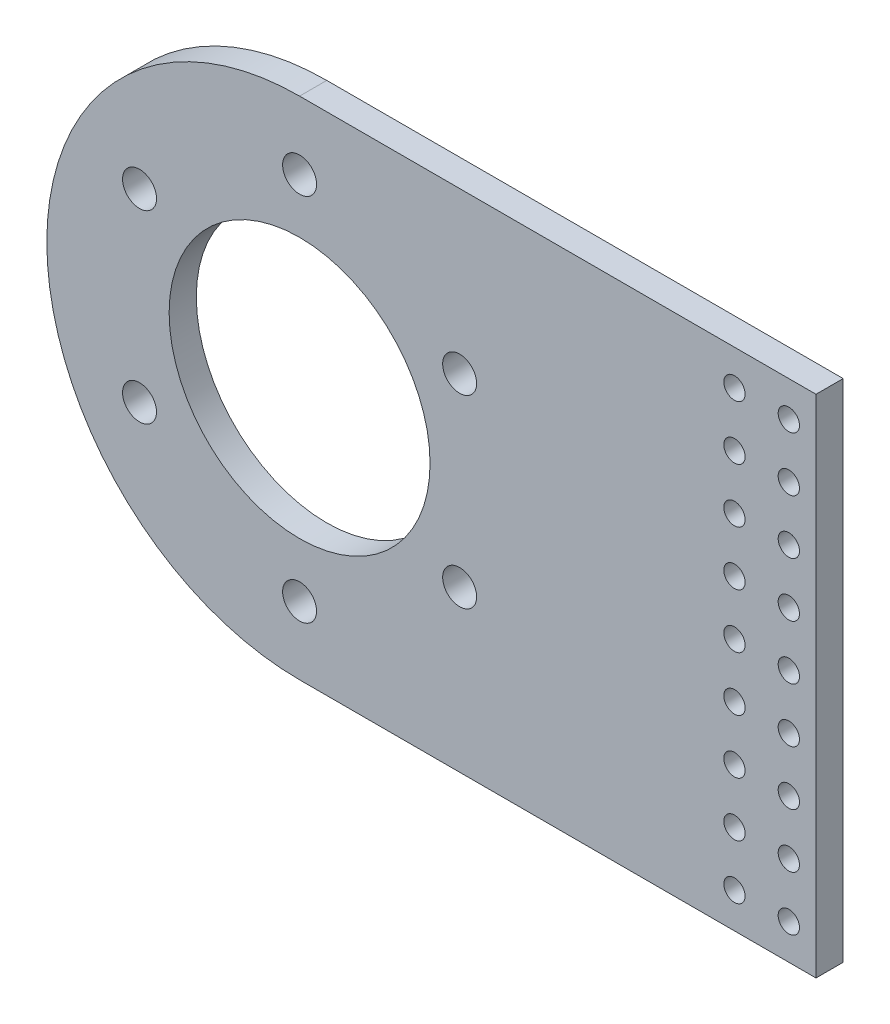
ISO-10303-21;
HEADER;
FILE_DESCRIPTION(('STEP AP214'),'2;1');
FILE_NAME('part.step','',(''),(''),'','','');
FILE_SCHEMA(('AUTOMOTIVE_DESIGN { 1 0 10303 214 1 1 1 1 }'));
ENDSEC;
DATA;
#1=APPLICATION_CONTEXT('core data for automotive mechanical design processes');
#2=APPLICATION_PROTOCOL_DEFINITION('international standard','automotive_design',2000,#1);
#3=PRODUCT_CONTEXT('',#1,'mechanical');
#4=PRODUCT('Part','Part','',(#3));
#5=PRODUCT_RELATED_PRODUCT_CATEGORY('part','',(#4));
#6=PRODUCT_DEFINITION_FORMATION('','',#4);
#7=PRODUCT_DEFINITION_CONTEXT('part definition',#1,'design');
#8=PRODUCT_DEFINITION('design','',#6,#7);
#9=PRODUCT_DEFINITION_SHAPE('','',#8);
#10=(LENGTH_UNIT() NAMED_UNIT(*) SI_UNIT(.MILLI.,.METRE.));
#11=(NAMED_UNIT(*) PLANE_ANGLE_UNIT() SI_UNIT($,.RADIAN.));
#12=(NAMED_UNIT(*) SI_UNIT($,.STERADIAN.) SOLID_ANGLE_UNIT());
#13=UNCERTAINTY_MEASURE_WITH_UNIT(LENGTH_MEASURE(1.E-05),#10,'distance_accuracy_value','');
#14=(GEOMETRIC_REPRESENTATION_CONTEXT(3) GLOBAL_UNCERTAINTY_ASSIGNED_CONTEXT((#13)) GLOBAL_UNIT_ASSIGNED_CONTEXT((#10,
#11,#12)) REPRESENTATION_CONTEXT('',''));
#15=CARTESIAN_POINT('',(0.,0.,0.));
#16=DIRECTION('',(0.,0.,1.));
#17=DIRECTION('',(1.,0.,0.));
#18=AXIS2_PLACEMENT_3D('',#15,#16,#17);
#19=CARTESIAN_POINT('',(0.,0.,6.35));
#20=DIRECTION('',(0.,0.,1.));
#21=DIRECTION('',(1.,0.,0.));
#22=AXIS2_PLACEMENT_3D('',#19,#20,#21);
#23=PLANE('',#22);
#24=CARTESIAN_POINT('',(37.394976935412,21.59,6.35));
#25=DIRECTION('',(0.,0.,1.));
#26=DIRECTION('',(1.,0.,0.));
#27=AXIS2_PLACEMENT_3D('',#24,#25,#26);
#28=CIRCLE('',#27,3.96875);
#29=CARTESIAN_POINT('',(41.3637269354121,21.59,6.35));
#30=VERTEX_POINT('',#29);
#31=EDGE_CURVE('E330',#30,#30,#28,.T.);
#32=ORIENTED_EDGE('',*,*,#31,.F.);
#33=EDGE_LOOP('',(#32));
#34=FACE_BOUND('',#33,.T.);
#35=CARTESIAN_POINT('',(37.3949769354121,-21.59,6.35));
#36=DIRECTION('',(0.,0.,1.));
#37=DIRECTION('',(1.,0.,0.));
#38=AXIS2_PLACEMENT_3D('',#35,#36,#37);
#39=CIRCLE('',#38,3.96875);
#40=CARTESIAN_POINT('',(41.3637269354121,-21.59,6.35));
#41=VERTEX_POINT('',#40);
#42=EDGE_CURVE('E322',#41,#41,#39,.T.);
#43=ORIENTED_EDGE('',*,*,#42,.F.);
#44=EDGE_LOOP('',(#43));
#45=FACE_BOUND('',#44,.T.);
#46=CARTESIAN_POINT('',(0.,-43.18,6.35));
#47=DIRECTION('',(0.,0.,1.));
#48=DIRECTION('',(1.,0.,0.));
#49=AXIS2_PLACEMENT_3D('',#46,#47,#48);
#50=CIRCLE('',#49,3.96875);
#51=CARTESIAN_POINT('',(3.96875,-43.18,6.35));
#52=VERTEX_POINT('',#51);
#53=EDGE_CURVE('E314',#52,#52,#50,.T.);
#54=ORIENTED_EDGE('',*,*,#53,.F.);
#55=EDGE_LOOP('',(#54));
#56=FACE_BOUND('',#55,.T.);
#57=CARTESIAN_POINT('',(-37.3949769354121,-21.59,6.35));
#58=DIRECTION('',(0.,0.,1.));
#59=DIRECTION('',(1.,0.,0.));
#60=AXIS2_PLACEMENT_3D('',#57,#58,#59);
#61=CIRCLE('',#60,3.96875);
#62=CARTESIAN_POINT('',(-33.4262269354121,-21.59,6.35));
#63=VERTEX_POINT('',#62);
#64=EDGE_CURVE('E306',#63,#63,#61,.T.);
#65=ORIENTED_EDGE('',*,*,#64,.F.);
#66=EDGE_LOOP('',(#65));
#67=FACE_BOUND('',#66,.T.);
#68=CARTESIAN_POINT('',(-37.3949769354121,21.59,6.35));
#69=DIRECTION('',(0.,0.,1.));
#70=DIRECTION('',(1.,0.,0.));
#71=AXIS2_PLACEMENT_3D('',#68,#69,#70);
#72=CIRCLE('',#71,3.96875);
#73=CARTESIAN_POINT('',(-33.4262269354121,21.59,6.35));
#74=VERTEX_POINT('',#73);
#75=EDGE_CURVE('E298',#74,#74,#72,.T.);
#76=ORIENTED_EDGE('',*,*,#75,.F.);
#77=EDGE_LOOP('',(#76));
#78=FACE_BOUND('',#77,.T.);
#79=CARTESIAN_POINT('',(0.,43.18,6.35));
#80=DIRECTION('',(0.,0.,1.));
#81=DIRECTION('',(1.,0.,0.));
#82=AXIS2_PLACEMENT_3D('',#79,#80,#81);
#83=CIRCLE('',#82,3.96875);
#84=CARTESIAN_POINT('',(3.96874999999999,43.18,6.35));
#85=VERTEX_POINT('',#84);
#86=EDGE_CURVE('E290',#85,#85,#83,.T.);
#87=ORIENTED_EDGE('',*,*,#86,.F.);
#88=EDGE_LOOP('',(#87));
#89=FACE_BOUND('',#88,.T.);
#90=CARTESIAN_POINT('',(114.3,-50.8,6.35));
#91=DIRECTION('',(0.,0.,1.));
#92=DIRECTION('',(1.,0.,0.));
#93=AXIS2_PLACEMENT_3D('',#90,#91,#92);
#94=CIRCLE('',#93,2.4892);
#95=CARTESIAN_POINT('',(116.7892,-50.8,6.35));
#96=VERTEX_POINT('',#95);
#97=EDGE_CURVE('E282',#96,#96,#94,.T.);
#98=ORIENTED_EDGE('',*,*,#97,.F.);
#99=EDGE_LOOP('',(#98));
#100=FACE_BOUND('',#99,.T.);
#101=CARTESIAN_POINT('',(101.6,-50.8000000000001,6.35));
#102=DIRECTION('',(0.,0.,1.));
#103=DIRECTION('',(1.,0.,0.));
#104=AXIS2_PLACEMENT_3D('',#101,#102,#103);
#105=CIRCLE('',#104,2.4892);
#106=CARTESIAN_POINT('',(104.0892,-50.8000000000001,6.35));
#107=VERTEX_POINT('',#106);
#108=EDGE_CURVE('E274',#107,#107,#105,.T.);
#109=ORIENTED_EDGE('',*,*,#108,.F.);
#110=EDGE_LOOP('',(#109));
#111=FACE_BOUND('',#110,.T.);
#112=CARTESIAN_POINT('',(101.6,-38.1000000000001,6.35));
#113=DIRECTION('',(0.,0.,1.));
#114=DIRECTION('',(1.,0.,0.));
#115=AXIS2_PLACEMENT_3D('',#112,#113,#114);
#116=CIRCLE('',#115,2.4892);
#117=CARTESIAN_POINT('',(104.0892,-38.1000000000001,6.35));
#118=VERTEX_POINT('',#117);
#119=EDGE_CURVE('E266',#118,#118,#116,.T.);
#120=ORIENTED_EDGE('',*,*,#119,.F.);
#121=EDGE_LOOP('',(#120));
#122=FACE_BOUND('',#121,.T.);
#123=CARTESIAN_POINT('',(101.6,-25.4000000000001,6.35));
#124=DIRECTION('',(0.,0.,1.));
#125=DIRECTION('',(1.,0.,0.));
#126=AXIS2_PLACEMENT_3D('',#123,#124,#125);
#127=CIRCLE('',#126,2.4892);
#128=CARTESIAN_POINT('',(104.0892,-25.4000000000001,6.35));
#129=VERTEX_POINT('',#128);
#130=EDGE_CURVE('E258',#129,#129,#127,.T.);
#131=ORIENTED_EDGE('',*,*,#130,.F.);
#132=EDGE_LOOP('',(#131));
#133=FACE_BOUND('',#132,.T.);
#134=CARTESIAN_POINT('',(101.6,-12.7000000000001,6.35));
#135=DIRECTION('',(0.,0.,1.));
#136=DIRECTION('',(1.,0.,0.));
#137=AXIS2_PLACEMENT_3D('',#134,#135,#136);
#138=CIRCLE('',#137,2.4892);
#139=CARTESIAN_POINT('',(104.0892,-12.7000000000001,6.35));
#140=VERTEX_POINT('',#139);
#141=EDGE_CURVE('E250',#140,#140,#138,.T.);
#142=ORIENTED_EDGE('',*,*,#141,.F.);
#143=EDGE_LOOP('',(#142));
#144=FACE_BOUND('',#143,.T.);
#145=CARTESIAN_POINT('',(101.6,0.,6.35));
#146=DIRECTION('',(0.,0.,1.));
#147=DIRECTION('',(1.,0.,0.));
#148=AXIS2_PLACEMENT_3D('',#145,#146,#147);
#149=CIRCLE('',#148,2.4892);
#150=CARTESIAN_POINT('',(104.0892,0.,6.35));
#151=VERTEX_POINT('',#150);
#152=EDGE_CURVE('E242',#151,#151,#149,.T.);
#153=ORIENTED_EDGE('',*,*,#152,.F.);
#154=EDGE_LOOP('',(#153));
#155=FACE_BOUND('',#154,.T.);
#156=CARTESIAN_POINT('',(101.6,12.6999999999999,6.35));
#157=DIRECTION('',(0.,0.,1.));
#158=DIRECTION('',(1.,0.,0.));
#159=AXIS2_PLACEMENT_3D('',#156,#157,#158);
#160=CIRCLE('',#159,2.4892);
#161=CARTESIAN_POINT('',(104.0892,12.6999999999999,6.35));
#162=VERTEX_POINT('',#161);
#163=EDGE_CURVE('E234',#162,#162,#160,.T.);
#164=ORIENTED_EDGE('',*,*,#163,.F.);
#165=EDGE_LOOP('',(#164));
#166=FACE_BOUND('',#165,.T.);
#167=CARTESIAN_POINT('',(101.6,25.3999999999999,6.35));
#168=DIRECTION('',(0.,0.,1.));
#169=DIRECTION('',(1.,0.,0.));
#170=AXIS2_PLACEMENT_3D('',#167,#168,#169);
#171=CIRCLE('',#170,2.4892);
#172=CARTESIAN_POINT('',(104.0892,25.3999999999999,6.35));
#173=VERTEX_POINT('',#172);
#174=EDGE_CURVE('E226',#173,#173,#171,.T.);
#175=ORIENTED_EDGE('',*,*,#174,.F.);
#176=EDGE_LOOP('',(#175));
#177=FACE_BOUND('',#176,.T.);
#178=CARTESIAN_POINT('',(101.6,38.0999999999999,6.35));
#179=DIRECTION('',(0.,0.,1.));
#180=DIRECTION('',(1.,0.,0.));
#181=AXIS2_PLACEMENT_3D('',#178,#179,#180);
#182=CIRCLE('',#181,2.4892);
#183=CARTESIAN_POINT('',(104.0892,38.0999999999999,6.35));
#184=VERTEX_POINT('',#183);
#185=EDGE_CURVE('E218',#184,#184,#182,.T.);
#186=ORIENTED_EDGE('',*,*,#185,.F.);
#187=EDGE_LOOP('',(#186));
#188=FACE_BOUND('',#187,.T.);
#189=CARTESIAN_POINT('',(101.6,50.7999999999999,6.35));
#190=DIRECTION('',(0.,0.,1.));
#191=DIRECTION('',(1.,0.,0.));
#192=AXIS2_PLACEMENT_3D('',#189,#190,#191);
#193=CIRCLE('',#192,2.4892);
#194=CARTESIAN_POINT('',(104.0892,50.7999999999999,6.35));
#195=VERTEX_POINT('',#194);
#196=EDGE_CURVE('E210',#195,#195,#193,.T.);
#197=ORIENTED_EDGE('',*,*,#196,.F.);
#198=EDGE_LOOP('',(#197));
#199=FACE_BOUND('',#198,.T.);
#200=CARTESIAN_POINT('',(114.3,-38.1,6.35));
#201=DIRECTION('',(0.,0.,1.));
#202=DIRECTION('',(1.,0.,0.));
#203=AXIS2_PLACEMENT_3D('',#200,#201,#202);
#204=CIRCLE('',#203,2.4892);
#205=CARTESIAN_POINT('',(116.7892,-38.1,6.35));
#206=VERTEX_POINT('',#205);
#207=EDGE_CURVE('E202',#206,#206,#204,.T.);
#208=ORIENTED_EDGE('',*,*,#207,.F.);
#209=EDGE_LOOP('',(#208));
#210=FACE_BOUND('',#209,.T.);
#211=CARTESIAN_POINT('',(114.3,-25.4,6.35));
#212=DIRECTION('',(0.,0.,1.));
#213=DIRECTION('',(1.,0.,0.));
#214=AXIS2_PLACEMENT_3D('',#211,#212,#213);
#215=CIRCLE('',#214,2.4892);
#216=CARTESIAN_POINT('',(116.7892,-25.4,6.35));
#217=VERTEX_POINT('',#216);
#218=EDGE_CURVE('E194',#217,#217,#215,.T.);
#219=ORIENTED_EDGE('',*,*,#218,.F.);
#220=EDGE_LOOP('',(#219));
#221=FACE_BOUND('',#220,.T.);
#222=CARTESIAN_POINT('',(114.3,-12.7,6.35));
#223=DIRECTION('',(0.,0.,1.));
#224=DIRECTION('',(1.,0.,0.));
#225=AXIS2_PLACEMENT_3D('',#222,#223,#224);
#226=CIRCLE('',#225,2.4892);
#227=CARTESIAN_POINT('',(116.7892,-12.7,6.35));
#228=VERTEX_POINT('',#227);
#229=EDGE_CURVE('E186',#228,#228,#226,.T.);
#230=ORIENTED_EDGE('',*,*,#229,.F.);
#231=EDGE_LOOP('',(#230));
#232=FACE_BOUND('',#231,.T.);
#233=CARTESIAN_POINT('',(114.3,0.,6.35));
#234=DIRECTION('',(0.,0.,1.));
#235=DIRECTION('',(1.,0.,0.));
#236=AXIS2_PLACEMENT_3D('',#233,#234,#235);
#237=CIRCLE('',#236,2.4892);
#238=CARTESIAN_POINT('',(116.7892,0.,6.35));
#239=VERTEX_POINT('',#238);
#240=EDGE_CURVE('E178',#239,#239,#237,.T.);
#241=ORIENTED_EDGE('',*,*,#240,.F.);
#242=EDGE_LOOP('',(#241));
#243=FACE_BOUND('',#242,.T.);
#244=CARTESIAN_POINT('',(114.3,12.7,6.35));
#245=DIRECTION('',(0.,0.,1.));
#246=DIRECTION('',(1.,0.,0.));
#247=AXIS2_PLACEMENT_3D('',#244,#245,#246);
#248=CIRCLE('',#247,2.4892);
#249=CARTESIAN_POINT('',(116.7892,12.7,6.35));
#250=VERTEX_POINT('',#249);
#251=EDGE_CURVE('E170',#250,#250,#248,.T.);
#252=ORIENTED_EDGE('',*,*,#251,.F.);
#253=EDGE_LOOP('',(#252));
#254=FACE_BOUND('',#253,.T.);
#255=CARTESIAN_POINT('',(114.3,25.4,6.35));
#256=DIRECTION('',(0.,0.,1.));
#257=DIRECTION('',(1.,0.,0.));
#258=AXIS2_PLACEMENT_3D('',#255,#256,#257);
#259=CIRCLE('',#258,2.4892);
#260=CARTESIAN_POINT('',(116.7892,25.4,6.35));
#261=VERTEX_POINT('',#260);
#262=EDGE_CURVE('E162',#261,#261,#259,.T.);
#263=ORIENTED_EDGE('',*,*,#262,.F.);
#264=EDGE_LOOP('',(#263));
#265=FACE_BOUND('',#264,.T.);
#266=CARTESIAN_POINT('',(114.3,38.1,6.35));
#267=DIRECTION('',(0.,0.,1.));
#268=DIRECTION('',(1.,0.,0.));
#269=AXIS2_PLACEMENT_3D('',#266,#267,#268);
#270=CIRCLE('',#269,2.4892);
#271=CARTESIAN_POINT('',(116.7892,38.1,6.35));
#272=VERTEX_POINT('',#271);
#273=EDGE_CURVE('E154',#272,#272,#270,.T.);
#274=ORIENTED_EDGE('',*,*,#273,.F.);
#275=EDGE_LOOP('',(#274));
#276=FACE_BOUND('',#275,.T.);
#277=CARTESIAN_POINT('',(114.3,50.8,6.35));
#278=DIRECTION('',(0.,0.,1.));
#279=DIRECTION('',(1.,0.,0.));
#280=AXIS2_PLACEMENT_3D('',#277,#278,#279);
#281=CIRCLE('',#280,2.4892);
#282=CARTESIAN_POINT('',(116.7892,50.8,6.35));
#283=VERTEX_POINT('',#282);
#284=EDGE_CURVE('E146',#283,#283,#281,.T.);
#285=ORIENTED_EDGE('',*,*,#284,.F.);
#286=EDGE_LOOP('',(#285));
#287=FACE_BOUND('',#286,.T.);
#288=CARTESIAN_POINT('',(0.,0.,6.35));
#289=DIRECTION('',(0.,0.,1.));
#290=DIRECTION('',(1.,0.,0.));
#291=AXIS2_PLACEMENT_3D('',#288,#289,#290);
#292=CIRCLE('',#291,59.055);
#293=CARTESIAN_POINT('',(0.,59.055,6.35));
#294=VERTEX_POINT('',#293);
#295=CARTESIAN_POINT('',(0.,-59.055,6.35));
#296=VERTEX_POINT('',#295);
#297=EDGE_CURVE('E97',#294,#296,#292,.T.);
#298=ORIENTED_EDGE('',*,*,#297,.T.);
#299=DIRECTION('',(1.,0.,0.));
#300=VECTOR('',#299,1.);
#301=CARTESIAN_POINT('',(0.,-59.055,6.35));
#302=LINE('',#301,#300);
#303=CARTESIAN_POINT('',(120.65,-59.055,6.35));
#304=VERTEX_POINT('',#303);
#305=EDGE_CURVE('E92',#296,#304,#302,.T.);
#306=ORIENTED_EDGE('',*,*,#305,.T.);
#307=DIRECTION('',(0.,1.,0.));
#308=VECTOR('',#307,1.);
#309=CARTESIAN_POINT('',(120.65,-59.055,6.35));
#310=LINE('',#309,#308);
#311=CARTESIAN_POINT('',(120.65,59.055,6.35));
#312=VERTEX_POINT('',#311);
#313=EDGE_CURVE('E95',#304,#312,#310,.T.);
#314=ORIENTED_EDGE('',*,*,#313,.T.);
#315=DIRECTION('',(-1.,0.,0.));
#316=VECTOR('',#315,1.);
#317=CARTESIAN_POINT('',(120.65,59.055,6.35));
#318=LINE('',#317,#316);
#319=EDGE_CURVE('E62',#312,#294,#318,.T.);
#320=ORIENTED_EDGE('',*,*,#319,.T.);
#321=EDGE_LOOP('',(#298,#306,#314,#320));
#322=FACE_BOUND('',#321,.T.);
#323=CARTESIAN_POINT('',(0.,0.,6.35));
#324=DIRECTION('',(0.,0.,1.));
#325=DIRECTION('',(1.,0.,0.));
#326=AXIS2_PLACEMENT_3D('',#323,#324,#325);
#327=CIRCLE('',#326,30.48);
#328=CARTESIAN_POINT('',(30.48,0.,6.35));
#329=VERTEX_POINT('',#328);
#330=EDGE_CURVE('E117',#329,#329,#327,.T.);
#331=ORIENTED_EDGE('',*,*,#330,.F.);
#332=EDGE_LOOP('',(#331));
#333=FACE_BOUND('',#332,.T.);
#334=ADVANCED_FACE('F44',(#34,#45,#56,#67,#78,#89,#100,#111,#122,#133,#144,#155,#166,#177,#188,
#199,#210,#221,#232,#243,#254,#265,#276,#287,#322,#333),#23,.T.);
#335=CARTESIAN_POINT('',(0.,0.,0.));
#336=DIRECTION('',(0.,0.,1.));
#337=DIRECTION('',(1.,0.,0.));
#338=AXIS2_PLACEMENT_3D('',#335,#336,#337);
#339=PLANE('',#338);
#340=CARTESIAN_POINT('',(37.394976935412,21.59,0.));
#341=DIRECTION('',(0.,0.,1.));
#342=DIRECTION('',(1.,0.,0.));
#343=AXIS2_PLACEMENT_3D('',#340,#341,#342);
#344=CIRCLE('',#343,3.96875);
#345=CARTESIAN_POINT('',(41.3637269354121,21.59,0.));
#346=VERTEX_POINT('',#345);
#347=EDGE_CURVE('E326',#346,#346,#344,.T.);
#348=ORIENTED_EDGE('',*,*,#347,.T.);
#349=EDGE_LOOP('',(#348));
#350=FACE_BOUND('',#349,.T.);
#351=CARTESIAN_POINT('',(37.3949769354121,-21.59,0.));
#352=DIRECTION('',(0.,0.,1.));
#353=DIRECTION('',(1.,0.,0.));
#354=AXIS2_PLACEMENT_3D('',#351,#352,#353);
#355=CIRCLE('',#354,3.96875);
#356=CARTESIAN_POINT('',(41.3637269354121,-21.59,0.));
#357=VERTEX_POINT('',#356);
#358=EDGE_CURVE('E318',#357,#357,#355,.T.);
#359=ORIENTED_EDGE('',*,*,#358,.T.);
#360=EDGE_LOOP('',(#359));
#361=FACE_BOUND('',#360,.T.);
#362=CARTESIAN_POINT('',(0.,-43.18,0.));
#363=DIRECTION('',(0.,0.,1.));
#364=DIRECTION('',(1.,0.,0.));
#365=AXIS2_PLACEMENT_3D('',#362,#363,#364);
#366=CIRCLE('',#365,3.96875);
#367=CARTESIAN_POINT('',(3.96875,-43.18,0.));
#368=VERTEX_POINT('',#367);
#369=EDGE_CURVE('E310',#368,#368,#366,.T.);
#370=ORIENTED_EDGE('',*,*,#369,.T.);
#371=EDGE_LOOP('',(#370));
#372=FACE_BOUND('',#371,.T.);
#373=CARTESIAN_POINT('',(-37.3949769354121,-21.59,0.));
#374=DIRECTION('',(0.,0.,1.));
#375=DIRECTION('',(1.,0.,0.));
#376=AXIS2_PLACEMENT_3D('',#373,#374,#375);
#377=CIRCLE('',#376,3.96875);
#378=CARTESIAN_POINT('',(-33.4262269354121,-21.59,0.));
#379=VERTEX_POINT('',#378);
#380=EDGE_CURVE('E302',#379,#379,#377,.T.);
#381=ORIENTED_EDGE('',*,*,#380,.T.);
#382=EDGE_LOOP('',(#381));
#383=FACE_BOUND('',#382,.T.);
#384=CARTESIAN_POINT('',(-37.3949769354121,21.59,0.));
#385=DIRECTION('',(0.,0.,1.));
#386=DIRECTION('',(1.,0.,0.));
#387=AXIS2_PLACEMENT_3D('',#384,#385,#386);
#388=CIRCLE('',#387,3.96875);
#389=CARTESIAN_POINT('',(-33.4262269354121,21.59,0.));
#390=VERTEX_POINT('',#389);
#391=EDGE_CURVE('E294',#390,#390,#388,.T.);
#392=ORIENTED_EDGE('',*,*,#391,.T.);
#393=EDGE_LOOP('',(#392));
#394=FACE_BOUND('',#393,.T.);
#395=CARTESIAN_POINT('',(0.,43.18,0.));
#396=DIRECTION('',(0.,0.,1.));
#397=DIRECTION('',(1.,0.,0.));
#398=AXIS2_PLACEMENT_3D('',#395,#396,#397);
#399=CIRCLE('',#398,3.96875);
#400=CARTESIAN_POINT('',(3.96874999999999,43.18,0.));
#401=VERTEX_POINT('',#400);
#402=EDGE_CURVE('E286',#401,#401,#399,.T.);
#403=ORIENTED_EDGE('',*,*,#402,.T.);
#404=EDGE_LOOP('',(#403));
#405=FACE_BOUND('',#404,.T.);
#406=CARTESIAN_POINT('',(114.3,-50.8,0.));
#407=DIRECTION('',(0.,0.,1.));
#408=DIRECTION('',(1.,0.,0.));
#409=AXIS2_PLACEMENT_3D('',#406,#407,#408);
#410=CIRCLE('',#409,2.4892);
#411=CARTESIAN_POINT('',(116.7892,-50.8,0.));
#412=VERTEX_POINT('',#411);
#413=EDGE_CURVE('E278',#412,#412,#410,.T.);
#414=ORIENTED_EDGE('',*,*,#413,.T.);
#415=EDGE_LOOP('',(#414));
#416=FACE_BOUND('',#415,.T.);
#417=CARTESIAN_POINT('',(101.6,-50.8000000000001,0.));
#418=DIRECTION('',(0.,0.,1.));
#419=DIRECTION('',(1.,0.,0.));
#420=AXIS2_PLACEMENT_3D('',#417,#418,#419);
#421=CIRCLE('',#420,2.4892);
#422=CARTESIAN_POINT('',(104.0892,-50.8000000000001,0.));
#423=VERTEX_POINT('',#422);
#424=EDGE_CURVE('E270',#423,#423,#421,.T.);
#425=ORIENTED_EDGE('',*,*,#424,.T.);
#426=EDGE_LOOP('',(#425));
#427=FACE_BOUND('',#426,.T.);
#428=CARTESIAN_POINT('',(101.6,-38.1000000000001,0.));
#429=DIRECTION('',(0.,0.,1.));
#430=DIRECTION('',(1.,0.,0.));
#431=AXIS2_PLACEMENT_3D('',#428,#429,#430);
#432=CIRCLE('',#431,2.4892);
#433=CARTESIAN_POINT('',(104.0892,-38.1000000000001,0.));
#434=VERTEX_POINT('',#433);
#435=EDGE_CURVE('E262',#434,#434,#432,.T.);
#436=ORIENTED_EDGE('',*,*,#435,.T.);
#437=EDGE_LOOP('',(#436));
#438=FACE_BOUND('',#437,.T.);
#439=CARTESIAN_POINT('',(101.6,-25.4000000000001,0.));
#440=DIRECTION('',(0.,0.,1.));
#441=DIRECTION('',(1.,0.,0.));
#442=AXIS2_PLACEMENT_3D('',#439,#440,#441);
#443=CIRCLE('',#442,2.4892);
#444=CARTESIAN_POINT('',(104.0892,-25.4000000000001,0.));
#445=VERTEX_POINT('',#444);
#446=EDGE_CURVE('E254',#445,#445,#443,.T.);
#447=ORIENTED_EDGE('',*,*,#446,.T.);
#448=EDGE_LOOP('',(#447));
#449=FACE_BOUND('',#448,.T.);
#450=CARTESIAN_POINT('',(101.6,-12.7000000000001,0.));
#451=DIRECTION('',(0.,0.,1.));
#452=DIRECTION('',(1.,0.,0.));
#453=AXIS2_PLACEMENT_3D('',#450,#451,#452);
#454=CIRCLE('',#453,2.4892);
#455=CARTESIAN_POINT('',(104.0892,-12.7000000000001,0.));
#456=VERTEX_POINT('',#455);
#457=EDGE_CURVE('E246',#456,#456,#454,.T.);
#458=ORIENTED_EDGE('',*,*,#457,.T.);
#459=EDGE_LOOP('',(#458));
#460=FACE_BOUND('',#459,.T.);
#461=CARTESIAN_POINT('',(101.6,0.,0.));
#462=DIRECTION('',(0.,0.,1.));
#463=DIRECTION('',(1.,0.,0.));
#464=AXIS2_PLACEMENT_3D('',#461,#462,#463);
#465=CIRCLE('',#464,2.4892);
#466=CARTESIAN_POINT('',(104.0892,0.,0.));
#467=VERTEX_POINT('',#466);
#468=EDGE_CURVE('E238',#467,#467,#465,.T.);
#469=ORIENTED_EDGE('',*,*,#468,.T.);
#470=EDGE_LOOP('',(#469));
#471=FACE_BOUND('',#470,.T.);
#472=CARTESIAN_POINT('',(101.6,12.6999999999999,0.));
#473=DIRECTION('',(0.,0.,1.));
#474=DIRECTION('',(1.,0.,0.));
#475=AXIS2_PLACEMENT_3D('',#472,#473,#474);
#476=CIRCLE('',#475,2.4892);
#477=CARTESIAN_POINT('',(104.0892,12.6999999999999,0.));
#478=VERTEX_POINT('',#477);
#479=EDGE_CURVE('E230',#478,#478,#476,.T.);
#480=ORIENTED_EDGE('',*,*,#479,.T.);
#481=EDGE_LOOP('',(#480));
#482=FACE_BOUND('',#481,.T.);
#483=CARTESIAN_POINT('',(101.6,25.3999999999999,0.));
#484=DIRECTION('',(0.,0.,1.));
#485=DIRECTION('',(1.,0.,0.));
#486=AXIS2_PLACEMENT_3D('',#483,#484,#485);
#487=CIRCLE('',#486,2.4892);
#488=CARTESIAN_POINT('',(104.0892,25.3999999999999,0.));
#489=VERTEX_POINT('',#488);
#490=EDGE_CURVE('E222',#489,#489,#487,.T.);
#491=ORIENTED_EDGE('',*,*,#490,.T.);
#492=EDGE_LOOP('',(#491));
#493=FACE_BOUND('',#492,.T.);
#494=CARTESIAN_POINT('',(101.6,38.0999999999999,0.));
#495=DIRECTION('',(0.,0.,1.));
#496=DIRECTION('',(1.,0.,0.));
#497=AXIS2_PLACEMENT_3D('',#494,#495,#496);
#498=CIRCLE('',#497,2.4892);
#499=CARTESIAN_POINT('',(104.0892,38.0999999999999,0.));
#500=VERTEX_POINT('',#499);
#501=EDGE_CURVE('E214',#500,#500,#498,.T.);
#502=ORIENTED_EDGE('',*,*,#501,.T.);
#503=EDGE_LOOP('',(#502));
#504=FACE_BOUND('',#503,.T.);
#505=CARTESIAN_POINT('',(101.6,50.7999999999999,0.));
#506=DIRECTION('',(0.,0.,1.));
#507=DIRECTION('',(1.,0.,0.));
#508=AXIS2_PLACEMENT_3D('',#505,#506,#507);
#509=CIRCLE('',#508,2.4892);
#510=CARTESIAN_POINT('',(104.0892,50.7999999999999,0.));
#511=VERTEX_POINT('',#510);
#512=EDGE_CURVE('E206',#511,#511,#509,.T.);
#513=ORIENTED_EDGE('',*,*,#512,.T.);
#514=EDGE_LOOP('',(#513));
#515=FACE_BOUND('',#514,.T.);
#516=CARTESIAN_POINT('',(114.3,-38.1,0.));
#517=DIRECTION('',(0.,0.,1.));
#518=DIRECTION('',(1.,0.,0.));
#519=AXIS2_PLACEMENT_3D('',#516,#517,#518);
#520=CIRCLE('',#519,2.4892);
#521=CARTESIAN_POINT('',(116.7892,-38.1,0.));
#522=VERTEX_POINT('',#521);
#523=EDGE_CURVE('E198',#522,#522,#520,.T.);
#524=ORIENTED_EDGE('',*,*,#523,.T.);
#525=EDGE_LOOP('',(#524));
#526=FACE_BOUND('',#525,.T.);
#527=CARTESIAN_POINT('',(114.3,-25.4,0.));
#528=DIRECTION('',(0.,0.,1.));
#529=DIRECTION('',(1.,0.,0.));
#530=AXIS2_PLACEMENT_3D('',#527,#528,#529);
#531=CIRCLE('',#530,2.4892);
#532=CARTESIAN_POINT('',(116.7892,-25.4,0.));
#533=VERTEX_POINT('',#532);
#534=EDGE_CURVE('E190',#533,#533,#531,.T.);
#535=ORIENTED_EDGE('',*,*,#534,.T.);
#536=EDGE_LOOP('',(#535));
#537=FACE_BOUND('',#536,.T.);
#538=CARTESIAN_POINT('',(114.3,-12.7,0.));
#539=DIRECTION('',(0.,0.,1.));
#540=DIRECTION('',(1.,0.,0.));
#541=AXIS2_PLACEMENT_3D('',#538,#539,#540);
#542=CIRCLE('',#541,2.4892);
#543=CARTESIAN_POINT('',(116.7892,-12.7,0.));
#544=VERTEX_POINT('',#543);
#545=EDGE_CURVE('E182',#544,#544,#542,.T.);
#546=ORIENTED_EDGE('',*,*,#545,.T.);
#547=EDGE_LOOP('',(#546));
#548=FACE_BOUND('',#547,.T.);
#549=CARTESIAN_POINT('',(114.3,0.,0.));
#550=DIRECTION('',(0.,0.,1.));
#551=DIRECTION('',(1.,0.,0.));
#552=AXIS2_PLACEMENT_3D('',#549,#550,#551);
#553=CIRCLE('',#552,2.4892);
#554=CARTESIAN_POINT('',(116.7892,0.,0.));
#555=VERTEX_POINT('',#554);
#556=EDGE_CURVE('E174',#555,#555,#553,.T.);
#557=ORIENTED_EDGE('',*,*,#556,.T.);
#558=EDGE_LOOP('',(#557));
#559=FACE_BOUND('',#558,.T.);
#560=CARTESIAN_POINT('',(114.3,12.7,0.));
#561=DIRECTION('',(0.,0.,1.));
#562=DIRECTION('',(1.,0.,0.));
#563=AXIS2_PLACEMENT_3D('',#560,#561,#562);
#564=CIRCLE('',#563,2.4892);
#565=CARTESIAN_POINT('',(116.7892,12.7,0.));
#566=VERTEX_POINT('',#565);
#567=EDGE_CURVE('E166',#566,#566,#564,.T.);
#568=ORIENTED_EDGE('',*,*,#567,.T.);
#569=EDGE_LOOP('',(#568));
#570=FACE_BOUND('',#569,.T.);
#571=CARTESIAN_POINT('',(114.3,25.4,0.));
#572=DIRECTION('',(0.,0.,1.));
#573=DIRECTION('',(1.,0.,0.));
#574=AXIS2_PLACEMENT_3D('',#571,#572,#573);
#575=CIRCLE('',#574,2.4892);
#576=CARTESIAN_POINT('',(116.7892,25.4,0.));
#577=VERTEX_POINT('',#576);
#578=EDGE_CURVE('E158',#577,#577,#575,.T.);
#579=ORIENTED_EDGE('',*,*,#578,.T.);
#580=EDGE_LOOP('',(#579));
#581=FACE_BOUND('',#580,.T.);
#582=CARTESIAN_POINT('',(114.3,38.1,0.));
#583=DIRECTION('',(0.,0.,1.));
#584=DIRECTION('',(1.,0.,0.));
#585=AXIS2_PLACEMENT_3D('',#582,#583,#584);
#586=CIRCLE('',#585,2.4892);
#587=CARTESIAN_POINT('',(116.7892,38.1,0.));
#588=VERTEX_POINT('',#587);
#589=EDGE_CURVE('E150',#588,#588,#586,.T.);
#590=ORIENTED_EDGE('',*,*,#589,.T.);
#591=EDGE_LOOP('',(#590));
#592=FACE_BOUND('',#591,.T.);
#593=CARTESIAN_POINT('',(114.3,50.8,0.));
#594=DIRECTION('',(0.,0.,1.));
#595=DIRECTION('',(1.,0.,0.));
#596=AXIS2_PLACEMENT_3D('',#593,#594,#595);
#597=CIRCLE('',#596,2.4892);
#598=CARTESIAN_POINT('',(116.7892,50.8,0.));
#599=VERTEX_POINT('',#598);
#600=EDGE_CURVE('E139',#599,#599,#597,.T.);
#601=ORIENTED_EDGE('',*,*,#600,.T.);
#602=EDGE_LOOP('',(#601));
#603=FACE_BOUND('',#602,.T.);
#604=CARTESIAN_POINT('',(0.,0.,0.));
#605=DIRECTION('',(0.,0.,1.));
#606=DIRECTION('',(1.,0.,0.));
#607=AXIS2_PLACEMENT_3D('',#604,#605,#606);
#608=CIRCLE('',#607,59.055);
#609=CARTESIAN_POINT('',(0.,59.055,0.));
#610=VERTEX_POINT('',#609);
#611=CARTESIAN_POINT('',(0.,-59.055,0.));
#612=VERTEX_POINT('',#611);
#613=EDGE_CURVE('E113',#610,#612,#608,.T.);
#614=ORIENTED_EDGE('',*,*,#613,.F.);
#615=DIRECTION('',(-1.,0.,0.));
#616=VECTOR('',#615,1.);
#617=CARTESIAN_POINT('',(120.65,59.055,0.));
#618=LINE('',#617,#616);
#619=CARTESIAN_POINT('',(120.65,59.055,0.));
#620=VERTEX_POINT('',#619);
#621=EDGE_CURVE('E85',#620,#610,#618,.T.);
#622=ORIENTED_EDGE('',*,*,#621,.F.);
#623=DIRECTION('',(0.,1.,0.));
#624=VECTOR('',#623,1.);
#625=CARTESIAN_POINT('',(120.65,-59.055,0.));
#626=LINE('',#625,#624);
#627=CARTESIAN_POINT('',(120.65,-59.055,0.));
#628=VERTEX_POINT('',#627);
#629=EDGE_CURVE('E79',#628,#620,#626,.T.);
#630=ORIENTED_EDGE('',*,*,#629,.F.);
#631=DIRECTION('',(1.,0.,0.));
#632=VECTOR('',#631,1.);
#633=CARTESIAN_POINT('',(0.,-59.055,0.));
#634=LINE('',#633,#632);
#635=EDGE_CURVE('E102',#612,#628,#634,.T.);
#636=ORIENTED_EDGE('',*,*,#635,.F.);
#637=EDGE_LOOP('',(#614,#622,#630,#636));
#638=FACE_BOUND('',#637,.T.);
#639=CARTESIAN_POINT('',(0.,0.,0.));
#640=DIRECTION('',(0.,0.,1.));
#641=DIRECTION('',(1.,0.,0.));
#642=AXIS2_PLACEMENT_3D('',#639,#640,#641);
#643=CIRCLE('',#642,30.48);
#644=CARTESIAN_POINT('',(30.48,0.,0.));
#645=VERTEX_POINT('',#644);
#646=EDGE_CURVE('E135',#645,#645,#643,.T.);
#647=ORIENTED_EDGE('',*,*,#646,.T.);
#648=EDGE_LOOP('',(#647));
#649=FACE_BOUND('',#648,.T.);
#650=ADVANCED_FACE('F130',(#350,#361,#372,#383,#394,#405,#416,#427,#438,#449,#460,#471,#482,
#493,#504,#515,#526,#537,#548,#559,#570,#581,#592,#603,#638,#649),#339,.F.);
#651=CARTESIAN_POINT('',(0.,0.,6.35));
#652=DIRECTION('',(0.,0.,-1.));
#653=DIRECTION('',(-1.,0.,0.));
#654=AXIS2_PLACEMENT_3D('',#651,#652,#653);
#655=CYLINDRICAL_SURFACE('',#654,59.055);
#656=ORIENTED_EDGE('',*,*,#613,.T.);
#657=DIRECTION('',(0.,0.,-1.));
#658=VECTOR('',#657,1.);
#659=CARTESIAN_POINT('',(0.,-59.055,6.35));
#660=LINE('',#659,#658);
#661=EDGE_CURVE('E11',#296,#612,#660,.T.);
#662=ORIENTED_EDGE('',*,*,#661,.F.);
#663=ORIENTED_EDGE('',*,*,#297,.F.);
#664=DIRECTION('',(0.,0.,-1.));
#665=VECTOR('',#664,1.);
#666=CARTESIAN_POINT('',(0.,59.055,6.35));
#667=LINE('',#666,#665);
#668=EDGE_CURVE('E109',#294,#610,#667,.T.);
#669=ORIENTED_EDGE('',*,*,#668,.T.);
#670=EDGE_LOOP('',(#656,#662,#663,#669));
#671=FACE_BOUND('',#670,.T.);
#672=ADVANCED_FACE('F46',(#671),#655,.T.);
#673=CARTESIAN_POINT('',(0.,-59.055,6.35));
#674=DIRECTION('',(0.,1.,0.));
#675=DIRECTION('',(-1.,0.,0.));
#676=AXIS2_PLACEMENT_3D('',#673,#674,#675);
#677=PLANE('',#676);
#678=ORIENTED_EDGE('',*,*,#635,.T.);
#679=DIRECTION('',(0.,0.,-1.));
#680=VECTOR('',#679,1.);
#681=CARTESIAN_POINT('',(120.65,-59.055,6.35));
#682=LINE('',#681,#680);
#683=EDGE_CURVE('E54',#304,#628,#682,.T.);
#684=ORIENTED_EDGE('',*,*,#683,.F.);
#685=ORIENTED_EDGE('',*,*,#305,.F.);
#686=ORIENTED_EDGE('',*,*,#661,.T.);
#687=EDGE_LOOP('',(#678,#684,#685,#686));
#688=FACE_BOUND('',#687,.T.);
#689=ADVANCED_FACE('F101',(#688),#677,.F.);
#690=CARTESIAN_POINT('',(120.65,-59.055,6.35));
#691=DIRECTION('',(-1.,0.,0.));
#692=DIRECTION('',(0.,0.,1.));
#693=AXIS2_PLACEMENT_3D('',#690,#691,#692);
#694=PLANE('',#693);
#695=ORIENTED_EDGE('',*,*,#629,.T.);
#696=DIRECTION('',(0.,0.,-1.));
#697=VECTOR('',#696,1.);
#698=CARTESIAN_POINT('',(120.65,59.055,6.35));
#699=LINE('',#698,#697);
#700=EDGE_CURVE('E104',#312,#620,#699,.T.);
#701=ORIENTED_EDGE('',*,*,#700,.F.);
#702=ORIENTED_EDGE('',*,*,#313,.F.);
#703=ORIENTED_EDGE('',*,*,#683,.T.);
#704=EDGE_LOOP('',(#695,#701,#702,#703));
#705=FACE_BOUND('',#704,.T.);
#706=ADVANCED_FACE('F105',(#705),#694,.F.);
#707=CARTESIAN_POINT('',(120.65,59.055,6.35));
#708=DIRECTION('',(0.,-1.,0.));
#709=DIRECTION('',(1.,0.,0.));
#710=AXIS2_PLACEMENT_3D('',#707,#708,#709);
#711=PLANE('',#710);
#712=ORIENTED_EDGE('',*,*,#621,.T.);
#713=ORIENTED_EDGE('',*,*,#668,.F.);
#714=ORIENTED_EDGE('',*,*,#319,.F.);
#715=ORIENTED_EDGE('',*,*,#700,.T.);
#716=EDGE_LOOP('',(#712,#713,#714,#715));
#717=FACE_BOUND('',#716,.T.);
#718=ADVANCED_FACE('F127',(#717),#711,.F.);
#719=CARTESIAN_POINT('',(0.,0.,6.35));
#720=DIRECTION('',(0.,0.,-1.));
#721=DIRECTION('',(-1.,0.,0.));
#722=AXIS2_PLACEMENT_3D('',#719,#720,#721);
#723=CYLINDRICAL_SURFACE('',#722,30.48);
#724=ORIENTED_EDGE('',*,*,#330,.T.);
#725=EDGE_LOOP('',(#724));
#726=FACE_BOUND('',#725,.T.);
#727=ORIENTED_EDGE('',*,*,#646,.F.);
#728=EDGE_LOOP('',(#727));
#729=FACE_BOUND('',#728,.T.);
#730=ADVANCED_FACE('F389',(#726,#729),#723,.F.);
#731=CARTESIAN_POINT('',(114.3,50.8,6.35));
#732=DIRECTION('',(0.,0.,1.));
#733=DIRECTION('',(1.,0.,0.));
#734=AXIS2_PLACEMENT_3D('',#731,#732,#733);
#735=CYLINDRICAL_SURFACE('',#734,2.4892);
#736=ORIENTED_EDGE('',*,*,#600,.F.);
#737=EDGE_LOOP('',(#736));
#738=FACE_BOUND('',#737,.T.);
#739=ORIENTED_EDGE('',*,*,#284,.T.);
#740=EDGE_LOOP('',(#739));
#741=FACE_BOUND('',#740,.T.);
#742=ADVANCED_FACE('F386',(#738,#741),#735,.F.);
#743=CARTESIAN_POINT('',(114.3,38.1,6.35));
#744=DIRECTION('',(0.,0.,1.));
#745=DIRECTION('',(1.,0.,0.));
#746=AXIS2_PLACEMENT_3D('',#743,#744,#745);
#747=CYLINDRICAL_SURFACE('',#746,2.4892);
#748=ORIENTED_EDGE('',*,*,#589,.F.);
#749=EDGE_LOOP('',(#748));
#750=FACE_BOUND('',#749,.T.);
#751=ORIENTED_EDGE('',*,*,#273,.T.);
#752=EDGE_LOOP('',(#751));
#753=FACE_BOUND('',#752,.T.);
#754=ADVANCED_FACE('F388',(#750,#753),#747,.F.);
#755=CARTESIAN_POINT('',(114.3,25.4,6.35));
#756=DIRECTION('',(0.,0.,1.));
#757=DIRECTION('',(1.,0.,0.));
#758=AXIS2_PLACEMENT_3D('',#755,#756,#757);
#759=CYLINDRICAL_SURFACE('',#758,2.4892);
#760=ORIENTED_EDGE('',*,*,#578,.F.);
#761=EDGE_LOOP('',(#760));
#762=FACE_BOUND('',#761,.T.);
#763=ORIENTED_EDGE('',*,*,#262,.T.);
#764=EDGE_LOOP('',(#763));
#765=FACE_BOUND('',#764,.T.);
#766=ADVANCED_FACE('F396',(#762,#765),#759,.F.);
#767=CARTESIAN_POINT('',(114.3,12.7,6.35));
#768=DIRECTION('',(0.,0.,1.));
#769=DIRECTION('',(1.,0.,0.));
#770=AXIS2_PLACEMENT_3D('',#767,#768,#769);
#771=CYLINDRICAL_SURFACE('',#770,2.4892);
#772=ORIENTED_EDGE('',*,*,#567,.F.);
#773=EDGE_LOOP('',(#772));
#774=FACE_BOUND('',#773,.T.);
#775=ORIENTED_EDGE('',*,*,#251,.T.);
#776=EDGE_LOOP('',(#775));
#777=FACE_BOUND('',#776,.T.);
#778=ADVANCED_FACE('F463',(#774,#777),#771,.F.);
#779=CARTESIAN_POINT('',(114.3,0.,6.35));
#780=DIRECTION('',(0.,0.,1.));
#781=DIRECTION('',(1.,0.,0.));
#782=AXIS2_PLACEMENT_3D('',#779,#780,#781);
#783=CYLINDRICAL_SURFACE('',#782,2.4892);
#784=ORIENTED_EDGE('',*,*,#556,.F.);
#785=EDGE_LOOP('',(#784));
#786=FACE_BOUND('',#785,.T.);
#787=ORIENTED_EDGE('',*,*,#240,.T.);
#788=EDGE_LOOP('',(#787));
#789=FACE_BOUND('',#788,.T.);
#790=ADVANCED_FACE('F472',(#786,#789),#783,.F.);
#791=CARTESIAN_POINT('',(114.3,-12.7,6.35));
#792=DIRECTION('',(0.,0.,1.));
#793=DIRECTION('',(1.,0.,0.));
#794=AXIS2_PLACEMENT_3D('',#791,#792,#793);
#795=CYLINDRICAL_SURFACE('',#794,2.4892);
#796=ORIENTED_EDGE('',*,*,#545,.F.);
#797=EDGE_LOOP('',(#796));
#798=FACE_BOUND('',#797,.T.);
#799=ORIENTED_EDGE('',*,*,#229,.T.);
#800=EDGE_LOOP('',(#799));
#801=FACE_BOUND('',#800,.T.);
#802=ADVANCED_FACE('F482',(#798,#801),#795,.F.);
#803=CARTESIAN_POINT('',(114.3,-25.4,6.35));
#804=DIRECTION('',(0.,0.,1.));
#805=DIRECTION('',(1.,0.,0.));
#806=AXIS2_PLACEMENT_3D('',#803,#804,#805);
#807=CYLINDRICAL_SURFACE('',#806,2.4892);
#808=ORIENTED_EDGE('',*,*,#534,.F.);
#809=EDGE_LOOP('',(#808));
#810=FACE_BOUND('',#809,.T.);
#811=ORIENTED_EDGE('',*,*,#218,.T.);
#812=EDGE_LOOP('',(#811));
#813=FACE_BOUND('',#812,.T.);
#814=ADVANCED_FACE('F492',(#810,#813),#807,.F.);
#815=CARTESIAN_POINT('',(114.3,-38.1,6.35));
#816=DIRECTION('',(0.,0.,1.));
#817=DIRECTION('',(1.,0.,0.));
#818=AXIS2_PLACEMENT_3D('',#815,#816,#817);
#819=CYLINDRICAL_SURFACE('',#818,2.4892);
#820=ORIENTED_EDGE('',*,*,#523,.F.);
#821=EDGE_LOOP('',(#820));
#822=FACE_BOUND('',#821,.T.);
#823=ORIENTED_EDGE('',*,*,#207,.T.);
#824=EDGE_LOOP('',(#823));
#825=FACE_BOUND('',#824,.T.);
#826=ADVANCED_FACE('F502',(#822,#825),#819,.F.);
#827=CARTESIAN_POINT('',(101.6,50.7999999999999,6.35));
#828=DIRECTION('',(0.,0.,1.));
#829=DIRECTION('',(1.,0.,0.));
#830=AXIS2_PLACEMENT_3D('',#827,#828,#829);
#831=CYLINDRICAL_SURFACE('',#830,2.4892);
#832=ORIENTED_EDGE('',*,*,#512,.F.);
#833=EDGE_LOOP('',(#832));
#834=FACE_BOUND('',#833,.T.);
#835=ORIENTED_EDGE('',*,*,#196,.T.);
#836=EDGE_LOOP('',(#835));
#837=FACE_BOUND('',#836,.T.);
#838=ADVANCED_FACE('F512',(#834,#837),#831,.F.);
#839=CARTESIAN_POINT('',(101.6,38.0999999999999,6.35));
#840=DIRECTION('',(0.,0.,1.));
#841=DIRECTION('',(1.,0.,0.));
#842=AXIS2_PLACEMENT_3D('',#839,#840,#841);
#843=CYLINDRICAL_SURFACE('',#842,2.4892);
#844=ORIENTED_EDGE('',*,*,#501,.F.);
#845=EDGE_LOOP('',(#844));
#846=FACE_BOUND('',#845,.T.);
#847=ORIENTED_EDGE('',*,*,#185,.T.);
#848=EDGE_LOOP('',(#847));
#849=FACE_BOUND('',#848,.T.);
#850=ADVANCED_FACE('F522',(#846,#849),#843,.F.);
#851=CARTESIAN_POINT('',(101.6,25.3999999999999,6.35));
#852=DIRECTION('',(0.,0.,1.));
#853=DIRECTION('',(1.,0.,0.));
#854=AXIS2_PLACEMENT_3D('',#851,#852,#853);
#855=CYLINDRICAL_SURFACE('',#854,2.4892);
#856=ORIENTED_EDGE('',*,*,#490,.F.);
#857=EDGE_LOOP('',(#856));
#858=FACE_BOUND('',#857,.T.);
#859=ORIENTED_EDGE('',*,*,#174,.T.);
#860=EDGE_LOOP('',(#859));
#861=FACE_BOUND('',#860,.T.);
#862=ADVANCED_FACE('F532',(#858,#861),#855,.F.);
#863=CARTESIAN_POINT('',(101.6,12.6999999999999,6.35));
#864=DIRECTION('',(0.,0.,1.));
#865=DIRECTION('',(1.,0.,0.));
#866=AXIS2_PLACEMENT_3D('',#863,#864,#865);
#867=CYLINDRICAL_SURFACE('',#866,2.4892);
#868=ORIENTED_EDGE('',*,*,#479,.F.);
#869=EDGE_LOOP('',(#868));
#870=FACE_BOUND('',#869,.T.);
#871=ORIENTED_EDGE('',*,*,#163,.T.);
#872=EDGE_LOOP('',(#871));
#873=FACE_BOUND('',#872,.T.);
#874=ADVANCED_FACE('F542',(#870,#873),#867,.F.);
#875=CARTESIAN_POINT('',(101.6,0.,6.35));
#876=DIRECTION('',(0.,0.,1.));
#877=DIRECTION('',(1.,0.,0.));
#878=AXIS2_PLACEMENT_3D('',#875,#876,#877);
#879=CYLINDRICAL_SURFACE('',#878,2.4892);
#880=ORIENTED_EDGE('',*,*,#468,.F.);
#881=EDGE_LOOP('',(#880));
#882=FACE_BOUND('',#881,.T.);
#883=ORIENTED_EDGE('',*,*,#152,.T.);
#884=EDGE_LOOP('',(#883));
#885=FACE_BOUND('',#884,.T.);
#886=ADVANCED_FACE('F552',(#882,#885),#879,.F.);
#887=CARTESIAN_POINT('',(101.6,-12.7000000000001,6.35));
#888=DIRECTION('',(0.,0.,1.));
#889=DIRECTION('',(1.,0.,0.));
#890=AXIS2_PLACEMENT_3D('',#887,#888,#889);
#891=CYLINDRICAL_SURFACE('',#890,2.4892);
#892=ORIENTED_EDGE('',*,*,#457,.F.);
#893=EDGE_LOOP('',(#892));
#894=FACE_BOUND('',#893,.T.);
#895=ORIENTED_EDGE('',*,*,#141,.T.);
#896=EDGE_LOOP('',(#895));
#897=FACE_BOUND('',#896,.T.);
#898=ADVANCED_FACE('F562',(#894,#897),#891,.F.);
#899=CARTESIAN_POINT('',(101.6,-25.4000000000001,6.35));
#900=DIRECTION('',(0.,0.,1.));
#901=DIRECTION('',(1.,0.,0.));
#902=AXIS2_PLACEMENT_3D('',#899,#900,#901);
#903=CYLINDRICAL_SURFACE('',#902,2.4892);
#904=ORIENTED_EDGE('',*,*,#446,.F.);
#905=EDGE_LOOP('',(#904));
#906=FACE_BOUND('',#905,.T.);
#907=ORIENTED_EDGE('',*,*,#130,.T.);
#908=EDGE_LOOP('',(#907));
#909=FACE_BOUND('',#908,.T.);
#910=ADVANCED_FACE('F572',(#906,#909),#903,.F.);
#911=CARTESIAN_POINT('',(101.6,-38.1000000000001,6.35));
#912=DIRECTION('',(0.,0.,1.));
#913=DIRECTION('',(1.,0.,0.));
#914=AXIS2_PLACEMENT_3D('',#911,#912,#913);
#915=CYLINDRICAL_SURFACE('',#914,2.4892);
#916=ORIENTED_EDGE('',*,*,#435,.F.);
#917=EDGE_LOOP('',(#916));
#918=FACE_BOUND('',#917,.T.);
#919=ORIENTED_EDGE('',*,*,#119,.T.);
#920=EDGE_LOOP('',(#919));
#921=FACE_BOUND('',#920,.T.);
#922=ADVANCED_FACE('F582',(#918,#921),#915,.F.);
#923=CARTESIAN_POINT('',(101.6,-50.8000000000001,6.35));
#924=DIRECTION('',(0.,0.,1.));
#925=DIRECTION('',(1.,0.,0.));
#926=AXIS2_PLACEMENT_3D('',#923,#924,#925);
#927=CYLINDRICAL_SURFACE('',#926,2.4892);
#928=ORIENTED_EDGE('',*,*,#424,.F.);
#929=EDGE_LOOP('',(#928));
#930=FACE_BOUND('',#929,.T.);
#931=ORIENTED_EDGE('',*,*,#108,.T.);
#932=EDGE_LOOP('',(#931));
#933=FACE_BOUND('',#932,.T.);
#934=ADVANCED_FACE('F592',(#930,#933),#927,.F.);
#935=CARTESIAN_POINT('',(114.3,-50.8,6.35));
#936=DIRECTION('',(0.,0.,1.));
#937=DIRECTION('',(1.,0.,0.));
#938=AXIS2_PLACEMENT_3D('',#935,#936,#937);
#939=CYLINDRICAL_SURFACE('',#938,2.4892);
#940=ORIENTED_EDGE('',*,*,#413,.F.);
#941=EDGE_LOOP('',(#940));
#942=FACE_BOUND('',#941,.T.);
#943=ORIENTED_EDGE('',*,*,#97,.T.);
#944=EDGE_LOOP('',(#943));
#945=FACE_BOUND('',#944,.T.);
#946=ADVANCED_FACE('F602',(#942,#945),#939,.F.);
#947=CARTESIAN_POINT('',(0.,43.18,6.35));
#948=DIRECTION('',(0.,0.,1.));
#949=DIRECTION('',(1.,0.,0.));
#950=AXIS2_PLACEMENT_3D('',#947,#948,#949);
#951=CYLINDRICAL_SURFACE('',#950,3.96875);
#952=ORIENTED_EDGE('',*,*,#402,.F.);
#953=EDGE_LOOP('',(#952));
#954=FACE_BOUND('',#953,.T.);
#955=ORIENTED_EDGE('',*,*,#86,.T.);
#956=EDGE_LOOP('',(#955));
#957=FACE_BOUND('',#956,.T.);
#958=ADVANCED_FACE('F612',(#954,#957),#951,.F.);
#959=CARTESIAN_POINT('',(-37.3949769354121,21.59,6.35));
#960=DIRECTION('',(0.,0.,1.));
#961=DIRECTION('',(1.,0.,0.));
#962=AXIS2_PLACEMENT_3D('',#959,#960,#961);
#963=CYLINDRICAL_SURFACE('',#962,3.96875);
#964=ORIENTED_EDGE('',*,*,#391,.F.);
#965=EDGE_LOOP('',(#964));
#966=FACE_BOUND('',#965,.T.);
#967=ORIENTED_EDGE('',*,*,#75,.T.);
#968=EDGE_LOOP('',(#967));
#969=FACE_BOUND('',#968,.T.);
#970=ADVANCED_FACE('F622',(#966,#969),#963,.F.);
#971=CARTESIAN_POINT('',(-37.3949769354121,-21.59,6.35));
#972=DIRECTION('',(0.,0.,1.));
#973=DIRECTION('',(1.,0.,0.));
#974=AXIS2_PLACEMENT_3D('',#971,#972,#973);
#975=CYLINDRICAL_SURFACE('',#974,3.96875);
#976=ORIENTED_EDGE('',*,*,#380,.F.);
#977=EDGE_LOOP('',(#976));
#978=FACE_BOUND('',#977,.T.);
#979=ORIENTED_EDGE('',*,*,#64,.T.);
#980=EDGE_LOOP('',(#979));
#981=FACE_BOUND('',#980,.T.);
#982=ADVANCED_FACE('F632',(#978,#981),#975,.F.);
#983=CARTESIAN_POINT('',(0.,-43.18,6.35));
#984=DIRECTION('',(0.,0.,1.));
#985=DIRECTION('',(1.,0.,0.));
#986=AXIS2_PLACEMENT_3D('',#983,#984,#985);
#987=CYLINDRICAL_SURFACE('',#986,3.96875);
#988=ORIENTED_EDGE('',*,*,#369,.F.);
#989=EDGE_LOOP('',(#988));
#990=FACE_BOUND('',#989,.T.);
#991=ORIENTED_EDGE('',*,*,#53,.T.);
#992=EDGE_LOOP('',(#991));
#993=FACE_BOUND('',#992,.T.);
#994=ADVANCED_FACE('F642',(#990,#993),#987,.F.);
#995=CARTESIAN_POINT('',(37.3949769354121,-21.59,6.35));
#996=DIRECTION('',(0.,0.,1.));
#997=DIRECTION('',(1.,0.,0.));
#998=AXIS2_PLACEMENT_3D('',#995,#996,#997);
#999=CYLINDRICAL_SURFACE('',#998,3.96875);
#1000=ORIENTED_EDGE('',*,*,#358,.F.);
#1001=EDGE_LOOP('',(#1000));
#1002=FACE_BOUND('',#1001,.T.);
#1003=ORIENTED_EDGE('',*,*,#42,.T.);
#1004=EDGE_LOOP('',(#1003));
#1005=FACE_BOUND('',#1004,.T.);
#1006=ADVANCED_FACE('F652',(#1002,#1005),#999,.F.);
#1007=CARTESIAN_POINT('',(37.394976935412,21.59,6.35));
#1008=DIRECTION('',(0.,0.,1.));
#1009=DIRECTION('',(1.,0.,0.));
#1010=AXIS2_PLACEMENT_3D('',#1007,#1008,#1009);
#1011=CYLINDRICAL_SURFACE('',#1010,3.96875);
#1012=ORIENTED_EDGE('',*,*,#347,.F.);
#1013=EDGE_LOOP('',(#1012));
#1014=FACE_BOUND('',#1013,.T.);
#1015=ORIENTED_EDGE('',*,*,#31,.T.);
#1016=EDGE_LOOP('',(#1015));
#1017=FACE_BOUND('',#1016,.T.);
#1018=ADVANCED_FACE('F335',(#1014,#1017),#1011,.F.);
#1019=CLOSED_SHELL('',(#334,#650,#672,#689,#706,#718,#730,#742,#754,#766,#778,#790,#802,#814,
#826,#838,#850,#862,#874,#886,#898,#910,#922,#934,#946,#958,#970,#982,#994,#1006,#1018));
#1020=MANIFOLD_SOLID_BREP('B2',#1019);
#1021=ADVANCED_BREP_SHAPE_REPRESENTATION('',(#18,#1020),#14);
#1022=SHAPE_DEFINITION_REPRESENTATION(#9,#1021);
ENDSEC;
END-ISO-10303-21;
